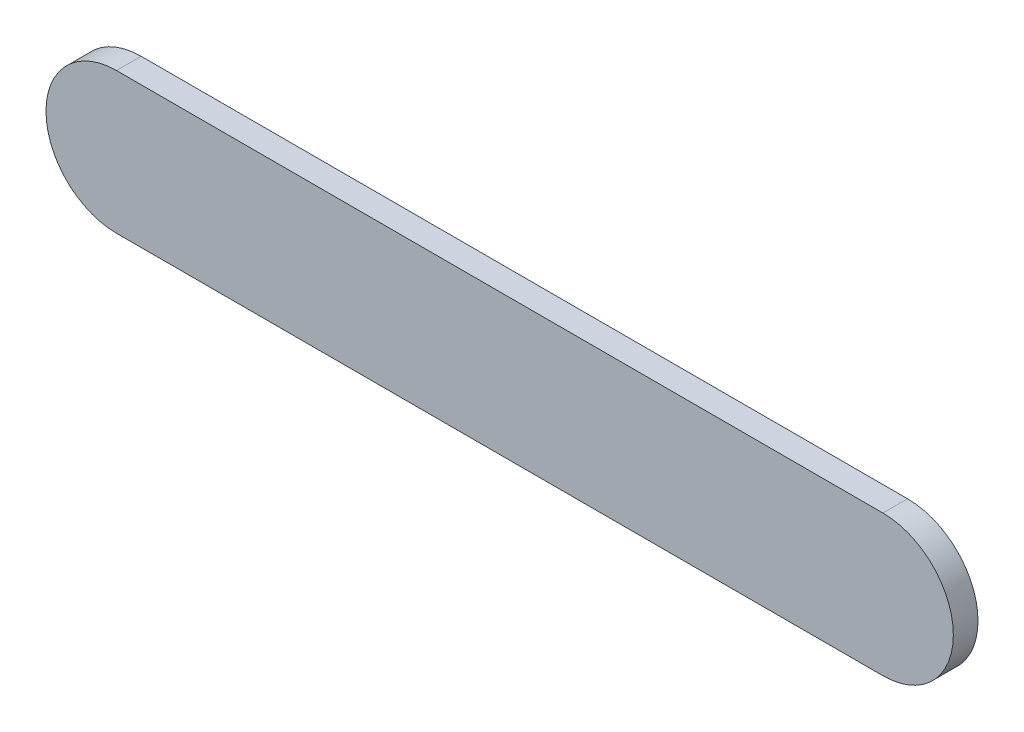
ISO-10303-21;
HEADER;
FILE_DESCRIPTION(('STEP AP214'),'2;1');
FILE_NAME('part.step','',(''),(''),'','','');
FILE_SCHEMA(('AUTOMOTIVE_DESIGN { 1 0 10303 214 1 1 1 1 }'));
ENDSEC;
DATA;
#1=APPLICATION_CONTEXT('core data for automotive mechanical design processes');
#2=APPLICATION_PROTOCOL_DEFINITION('international standard','automotive_design',2000,#1);
#3=PRODUCT_CONTEXT('',#1,'mechanical');
#4=PRODUCT('Part','Part','',(#3));
#5=PRODUCT_RELATED_PRODUCT_CATEGORY('part','',(#4));
#6=PRODUCT_DEFINITION_FORMATION('','',#4);
#7=PRODUCT_DEFINITION_CONTEXT('part definition',#1,'design');
#8=PRODUCT_DEFINITION('design','',#6,#7);
#9=PRODUCT_DEFINITION_SHAPE('','',#8);
#10=(LENGTH_UNIT() NAMED_UNIT(*) SI_UNIT(.MILLI.,.METRE.));
#11=(NAMED_UNIT(*) PLANE_ANGLE_UNIT() SI_UNIT($,.RADIAN.));
#12=(NAMED_UNIT(*) SI_UNIT($,.STERADIAN.) SOLID_ANGLE_UNIT());
#13=UNCERTAINTY_MEASURE_WITH_UNIT(LENGTH_MEASURE(1.E-05),#10,'distance_accuracy_value','');
#14=(GEOMETRIC_REPRESENTATION_CONTEXT(3) GLOBAL_UNCERTAINTY_ASSIGNED_CONTEXT((#13)) GLOBAL_UNIT_ASSIGNED_CONTEXT((#10,
#11,#12)) REPRESENTATION_CONTEXT('',''));
#15=CARTESIAN_POINT('',(0.,0.,0.));
#16=DIRECTION('',(0.,0.,1.));
#17=DIRECTION('',(1.,0.,0.));
#18=AXIS2_PLACEMENT_3D('',#15,#16,#17);
#19=CARTESIAN_POINT('',(81.5125,-112.5,1.635));
#20=DIRECTION('',(0.,0.,1.));
#21=DIRECTION('',(1.,0.,0.));
#22=AXIS2_PLACEMENT_3D('',#19,#20,#21);
#23=PLANE('',#22);
#24=DIRECTION('',(1.,0.,0.));
#25=VECTOR('',#24,1.);
#26=CARTESIAN_POINT('',(81.5125,-112.5,1.635));
#27=LINE('',#26,#25);
#28=CARTESIAN_POINT('',(81.5125,-112.5,1.635));
#29=VERTEX_POINT('',#28);
#30=CARTESIAN_POINT('',(82.6,-112.5,1.635));
#31=VERTEX_POINT('',#30);
#32=EDGE_CURVE('E69',#29,#31,#27,.T.);
#33=ORIENTED_EDGE('',*,*,#32,.T.);
#34=CARTESIAN_POINT('',(82.6,-112.4,1.635));
#35=DIRECTION('',(0.,0.,1.));
#36=DIRECTION('',(-1.42108547152E-13,-1.,0.));
#37=AXIS2_PLACEMENT_3D('',#34,#35,#36);
#38=CIRCLE('',#37,0.1);
#39=CARTESIAN_POINT('',(82.6,-112.3,1.635));
#40=VERTEX_POINT('',#39);
#41=EDGE_CURVE('E66',#31,#40,#38,.T.);
#42=ORIENTED_EDGE('',*,*,#41,.T.);
#43=DIRECTION('',(-1.,0.,0.));
#44=VECTOR('',#43,1.);
#45=CARTESIAN_POINT('',(82.6,-112.3,1.635));
#46=LINE('',#45,#44);
#47=CARTESIAN_POINT('',(81.5125,-112.3,1.635));
#48=VERTEX_POINT('',#47);
#49=EDGE_CURVE('E20',#40,#48,#46,.T.);
#50=ORIENTED_EDGE('',*,*,#49,.T.);
#51=CARTESIAN_POINT('',(81.5125,-112.4,1.635));
#52=DIRECTION('',(0.,0.,1.));
#53=DIRECTION('',(0.,1.,0.));
#54=AXIS2_PLACEMENT_3D('',#51,#52,#53);
#55=CIRCLE('',#54,0.1);
#56=EDGE_CURVE('E11',#48,#29,#55,.T.);
#57=ORIENTED_EDGE('',*,*,#56,.T.);
#58=EDGE_LOOP('',(#33,#42,#50,#57));
#59=FACE_BOUND('',#58,.T.);
#60=ADVANCED_FACE('F17',(#59),#23,.T.);
#61=CARTESIAN_POINT('',(81.5125,-112.5,1.6));
#62=DIRECTION('',(0.,0.,1.));
#63=DIRECTION('',(1.,0.,0.));
#64=AXIS2_PLACEMENT_3D('',#61,#62,#63);
#65=PLANE('',#64);
#66=CARTESIAN_POINT('',(81.5125,-112.4,1.6));
#67=DIRECTION('',(0.,0.,1.));
#68=DIRECTION('',(0.,1.,0.));
#69=AXIS2_PLACEMENT_3D('',#66,#67,#68);
#70=CIRCLE('',#69,0.1);
#71=CARTESIAN_POINT('',(81.5125,-112.3,1.6));
#72=VERTEX_POINT('',#71);
#73=CARTESIAN_POINT('',(81.5125,-112.5,1.6));
#74=VERTEX_POINT('',#73);
#75=EDGE_CURVE('E27',#72,#74,#70,.T.);
#76=ORIENTED_EDGE('',*,*,#75,.F.);
#77=DIRECTION('',(-1.,0.,0.));
#78=VECTOR('',#77,1.);
#79=CARTESIAN_POINT('',(82.6,-112.3,1.6));
#80=LINE('',#79,#78);
#81=CARTESIAN_POINT('',(82.6,-112.3,1.6));
#82=VERTEX_POINT('',#81);
#83=EDGE_CURVE('E74',#82,#72,#80,.T.);
#84=ORIENTED_EDGE('',*,*,#83,.F.);
#85=CARTESIAN_POINT('',(82.6,-112.4,1.6));
#86=DIRECTION('',(0.,0.,1.));
#87=DIRECTION('',(-1.42108547152E-13,-1.,0.));
#88=AXIS2_PLACEMENT_3D('',#85,#86,#87);
#89=CIRCLE('',#88,0.1);
#90=CARTESIAN_POINT('',(82.6,-112.5,1.6));
#91=VERTEX_POINT('',#90);
#92=EDGE_CURVE('E78',#91,#82,#89,.T.);
#93=ORIENTED_EDGE('',*,*,#92,.F.);
#94=DIRECTION('',(1.,0.,0.));
#95=VECTOR('',#94,1.);
#96=CARTESIAN_POINT('',(81.5125,-112.5,1.6));
#97=LINE('',#96,#95);
#98=EDGE_CURVE('E138',#74,#91,#97,.T.);
#99=ORIENTED_EDGE('',*,*,#98,.F.);
#100=EDGE_LOOP('',(#76,#84,#93,#99));
#101=FACE_BOUND('',#100,.T.);
#102=ADVANCED_FACE('F154',(#101),#65,.F.);
#103=CARTESIAN_POINT('',(81.5125,-112.4,1.6));
#104=DIRECTION('',(0.,0.,-1.));
#105=DIRECTION('',(0.,1.,0.));
#106=AXIS2_PLACEMENT_3D('',#103,#104,#105);
#107=CYLINDRICAL_SURFACE('',#106,0.1);
#108=ORIENTED_EDGE('',*,*,#75,.T.);
#109=DIRECTION('',(0.,0.,1.));
#110=VECTOR('',#109,1.);
#111=CARTESIAN_POINT('',(81.5125,-112.5,1.6));
#112=LINE('',#111,#110);
#113=EDGE_CURVE('E85',#74,#29,#112,.T.);
#114=ORIENTED_EDGE('',*,*,#113,.T.);
#115=ORIENTED_EDGE('',*,*,#56,.F.);
#116=DIRECTION('',(0.,0.,1.));
#117=VECTOR('',#116,1.);
#118=CARTESIAN_POINT('',(81.5125,-112.3,1.6));
#119=LINE('',#118,#117);
#120=EDGE_CURVE('E61',#72,#48,#119,.T.);
#121=ORIENTED_EDGE('',*,*,#120,.F.);
#122=EDGE_LOOP('',(#108,#114,#115,#121));
#123=FACE_BOUND('',#122,.T.);
#124=ADVANCED_FACE('F162',(#123),#107,.T.);
#125=CARTESIAN_POINT('',(82.6,-112.3,1.6));
#126=DIRECTION('',(0.,-1.,0.));
#127=DIRECTION('',(0.,0.,-1.));
#128=AXIS2_PLACEMENT_3D('',#125,#126,#127);
#129=PLANE('',#128);
#130=ORIENTED_EDGE('',*,*,#83,.T.);
#131=ORIENTED_EDGE('',*,*,#120,.T.);
#132=ORIENTED_EDGE('',*,*,#49,.F.);
#133=DIRECTION('',(0.,0.,1.));
#134=VECTOR('',#133,1.);
#135=CARTESIAN_POINT('',(82.6,-112.3,1.6));
#136=LINE('',#135,#134);
#137=EDGE_CURVE('E59',#82,#40,#136,.T.);
#138=ORIENTED_EDGE('',*,*,#137,.F.);
#139=EDGE_LOOP('',(#130,#131,#132,#138));
#140=FACE_BOUND('',#139,.T.);
#141=ADVANCED_FACE('F57',(#140),#129,.F.);
#142=CARTESIAN_POINT('',(82.6,-112.4,1.6));
#143=DIRECTION('',(0.,0.,-1.));
#144=DIRECTION('',(-1.42108547152E-13,-1.,0.));
#145=AXIS2_PLACEMENT_3D('',#142,#143,#144);
#146=CYLINDRICAL_SURFACE('',#145,0.1);
#147=ORIENTED_EDGE('',*,*,#92,.T.);
#148=ORIENTED_EDGE('',*,*,#137,.T.);
#149=ORIENTED_EDGE('',*,*,#41,.F.);
#150=DIRECTION('',(0.,0.,1.));
#151=VECTOR('',#150,1.);
#152=CARTESIAN_POINT('',(82.6,-112.5,1.6));
#153=LINE('',#152,#151);
#154=EDGE_CURVE('E134',#91,#31,#153,.T.);
#155=ORIENTED_EDGE('',*,*,#154,.F.);
#156=EDGE_LOOP('',(#147,#148,#149,#155));
#157=FACE_BOUND('',#156,.T.);
#158=ADVANCED_FACE('F76',(#157),#146,.T.);
#159=CARTESIAN_POINT('',(81.5125,-112.5,1.6));
#160=DIRECTION('',(0.,1.,0.));
#161=DIRECTION('',(1.,0.,0.));
#162=AXIS2_PLACEMENT_3D('',#159,#160,#161);
#163=PLANE('',#162);
#164=ORIENTED_EDGE('',*,*,#98,.T.);
#165=ORIENTED_EDGE('',*,*,#154,.T.);
#166=ORIENTED_EDGE('',*,*,#32,.F.);
#167=ORIENTED_EDGE('',*,*,#113,.F.);
#168=EDGE_LOOP('',(#164,#165,#166,#167));
#169=FACE_BOUND('',#168,.T.);
#170=ADVANCED_FACE('F112',(#169),#163,.F.);
#171=CLOSED_SHELL('',(#60,#102,#124,#141,#158,#170));
#172=MANIFOLD_SOLID_BREP('B1',#171);
#173=ADVANCED_BREP_SHAPE_REPRESENTATION('',(#18,#172),#14);
#174=SHAPE_DEFINITION_REPRESENTATION(#9,#173);
ENDSEC;
END-ISO-10303-21;
